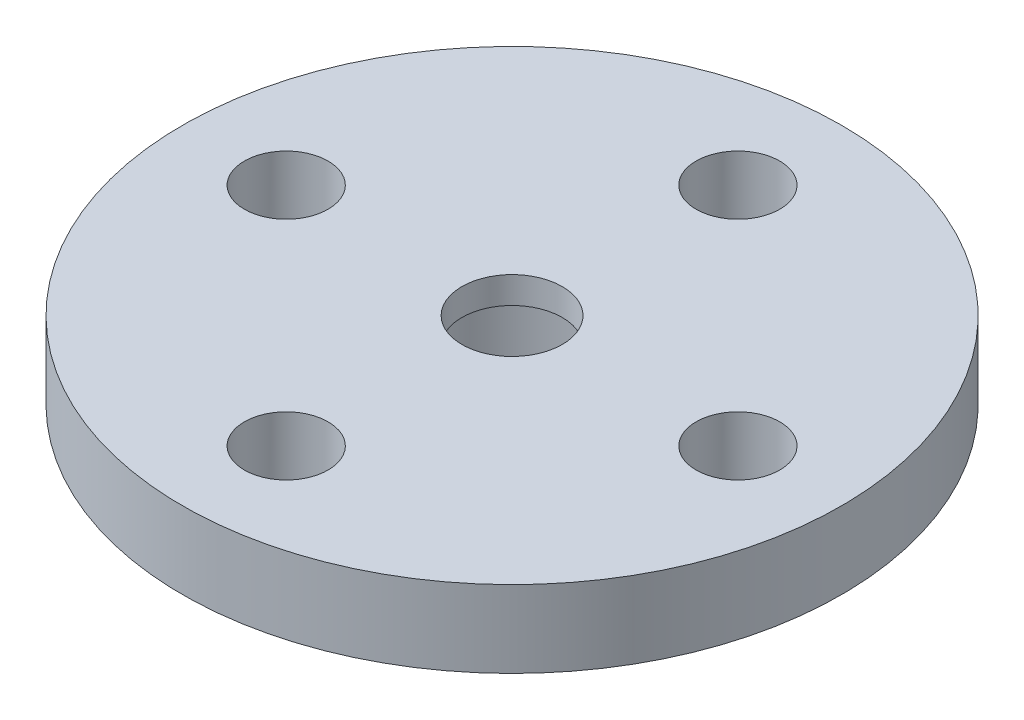
ISO-10303-21;
HEADER;
FILE_DESCRIPTION(('STEP AP214'),'2;1');
FILE_NAME('part.step','',(''),(''),'','','');
FILE_SCHEMA(('AUTOMOTIVE_DESIGN { 1 0 10303 214 1 1 1 1 }'));
ENDSEC;
DATA;
#1=APPLICATION_CONTEXT('core data for automotive mechanical design processes');
#2=APPLICATION_PROTOCOL_DEFINITION('international standard','automotive_design',2000,#1);
#3=PRODUCT_CONTEXT('',#1,'mechanical');
#4=PRODUCT('Part','Part','',(#3));
#5=PRODUCT_RELATED_PRODUCT_CATEGORY('part','',(#4));
#6=PRODUCT_DEFINITION_FORMATION('','',#4);
#7=PRODUCT_DEFINITION_CONTEXT('part definition',#1,'design');
#8=PRODUCT_DEFINITION('design','',#6,#7);
#9=PRODUCT_DEFINITION_SHAPE('','',#8);
#10=(LENGTH_UNIT() NAMED_UNIT(*) SI_UNIT(.MILLI.,.METRE.));
#11=(NAMED_UNIT(*) PLANE_ANGLE_UNIT() SI_UNIT($,.RADIAN.));
#12=(NAMED_UNIT(*) SI_UNIT($,.STERADIAN.) SOLID_ANGLE_UNIT());
#13=UNCERTAINTY_MEASURE_WITH_UNIT(LENGTH_MEASURE(1.E-05),#10,'distance_accuracy_value','');
#14=(GEOMETRIC_REPRESENTATION_CONTEXT(3) GLOBAL_UNCERTAINTY_ASSIGNED_CONTEXT((#13)) GLOBAL_UNIT_ASSIGNED_CONTEXT((#10,
#11,#12)) REPRESENTATION_CONTEXT('',''));
#15=CARTESIAN_POINT('',(0.,0.,0.));
#16=DIRECTION('',(0.,0.,1.));
#17=DIRECTION('',(1.,0.,0.));
#18=AXIS2_PLACEMENT_3D('',#15,#16,#17);
#19=CARTESIAN_POINT('',(0.,0.,0.));
#20=DIRECTION('',(0.,-1.,0.));
#21=DIRECTION('',(0.,0.,-1.));
#22=AXIS2_PLACEMENT_3D('',#19,#20,#21);
#23=CYLINDRICAL_SURFACE('',#22,1.5);
#24=CARTESIAN_POINT('',(0.,-0.8,0.));
#25=DIRECTION('',(0.,-1.,0.));
#26=DIRECTION('',(0.,0.,-1.));
#27=AXIS2_PLACEMENT_3D('',#24,#25,#26);
#28=CIRCLE('',#27,1.5);
#29=CARTESIAN_POINT('',(0.,-0.8,-1.5));
#30=VERTEX_POINT('',#29);
#31=EDGE_CURVE('E70',#30,#30,#28,.T.);
#32=ORIENTED_EDGE('',*,*,#31,.T.);
#33=EDGE_LOOP('',(#32));
#34=FACE_BOUND('',#33,.T.);
#35=CARTESIAN_POINT('',(0.,0.,0.));
#36=DIRECTION('',(0.,-1.,0.));
#37=DIRECTION('',(0.,0.,-1.));
#38=AXIS2_PLACEMENT_3D('',#35,#36,#37);
#39=CIRCLE('',#38,1.5);
#40=CARTESIAN_POINT('',(0.,0.,-1.5));
#41=VERTEX_POINT('',#40);
#42=EDGE_CURVE('E10',#41,#41,#39,.T.);
#43=ORIENTED_EDGE('',*,*,#42,.F.);
#44=EDGE_LOOP('',(#43));
#45=FACE_BOUND('',#44,.T.);
#46=ADVANCED_FACE('F42',(#34,#45),#23,.F.);
#47=CARTESIAN_POINT('',(1.5,0.,0.));
#48=DIRECTION('',(0.,1.,0.));
#49=DIRECTION('',(0.,0.,1.));
#50=AXIS2_PLACEMENT_3D('',#47,#48,#49);
#51=PLANE('',#50);
#52=CARTESIAN_POINT('',(0.,0.,-6.75));
#53=DIRECTION('',(0.,1.,0.));
#54=DIRECTION('',(0.,0.,1.));
#55=AXIS2_PLACEMENT_3D('',#52,#53,#54);
#56=CIRCLE('',#55,1.24999999999999);
#57=CARTESIAN_POINT('',(0.,0.,-5.50000000000001));
#58=VERTEX_POINT('',#57);
#59=EDGE_CURVE('E91',#58,#58,#56,.T.);
#60=ORIENTED_EDGE('',*,*,#59,.F.);
#61=EDGE_LOOP('',(#60));
#62=FACE_BOUND('',#61,.T.);
#63=CARTESIAN_POINT('',(6.75,0.,0.));
#64=DIRECTION('',(0.,1.,0.));
#65=DIRECTION('',(0.,0.,1.));
#66=AXIS2_PLACEMENT_3D('',#63,#64,#65);
#67=CIRCLE('',#66,1.24999999999999);
#68=CARTESIAN_POINT('',(6.75,0.,1.24999999999999));
#69=VERTEX_POINT('',#68);
#70=EDGE_CURVE('E85',#69,#69,#67,.T.);
#71=ORIENTED_EDGE('',*,*,#70,.F.);
#72=EDGE_LOOP('',(#71));
#73=FACE_BOUND('',#72,.T.);
#74=CARTESIAN_POINT('',(0.,0.,6.75));
#75=DIRECTION('',(0.,1.,0.));
#76=DIRECTION('',(0.,0.,1.));
#77=AXIS2_PLACEMENT_3D('',#74,#75,#76);
#78=CIRCLE('',#77,1.24999999999999);
#79=CARTESIAN_POINT('',(0.,0.,7.99999999999999));
#80=VERTEX_POINT('',#79);
#81=EDGE_CURVE('E82',#80,#80,#78,.T.);
#82=ORIENTED_EDGE('',*,*,#81,.F.);
#83=EDGE_LOOP('',(#82));
#84=FACE_BOUND('',#83,.T.);
#85=CARTESIAN_POINT('',(-6.75,0.,0.));
#86=DIRECTION('',(0.,1.,0.));
#87=DIRECTION('',(0.,0.,1.));
#88=AXIS2_PLACEMENT_3D('',#85,#86,#87);
#89=CIRCLE('',#88,1.24999999999999);
#90=CARTESIAN_POINT('',(-6.75,0.,1.24999999999999));
#91=VERTEX_POINT('',#90);
#92=EDGE_CURVE('E76',#91,#91,#89,.T.);
#93=ORIENTED_EDGE('',*,*,#92,.F.);
#94=EDGE_LOOP('',(#93));
#95=FACE_BOUND('',#94,.T.);
#96=ORIENTED_EDGE('',*,*,#42,.T.);
#97=EDGE_LOOP('',(#96));
#98=FACE_BOUND('',#97,.T.);
#99=CARTESIAN_POINT('',(0.,0.,0.));
#100=DIRECTION('',(0.,-1.,0.));
#101=DIRECTION('',(0.,0.,-1.));
#102=AXIS2_PLACEMENT_3D('',#99,#100,#101);
#103=CIRCLE('',#102,9.85);
#104=CARTESIAN_POINT('',(0.,0.,-9.85));
#105=VERTEX_POINT('',#104);
#106=EDGE_CURVE('E49',#105,#105,#103,.T.);
#107=ORIENTED_EDGE('',*,*,#106,.F.);
#108=EDGE_LOOP('',(#107));
#109=FACE_BOUND('',#108,.T.);
#110=ADVANCED_FACE('F97',(#62,#73,#84,#95,#98,#109),#51,.T.);
#111=CARTESIAN_POINT('',(0.,0.,0.));
#112=DIRECTION('',(0.,-1.,0.));
#113=DIRECTION('',(0.,0.,-1.));
#114=AXIS2_PLACEMENT_3D('',#111,#112,#113);
#115=CYLINDRICAL_SURFACE('',#114,9.85);
#116=ORIENTED_EDGE('',*,*,#106,.T.);
#117=EDGE_LOOP('',(#116));
#118=FACE_BOUND('',#117,.T.);
#119=CARTESIAN_POINT('',(0.,-2.3,0.));
#120=DIRECTION('',(0.,-1.,0.));
#121=DIRECTION('',(0.,0.,-1.));
#122=AXIS2_PLACEMENT_3D('',#119,#120,#121);
#123=CIRCLE('',#122,9.85);
#124=CARTESIAN_POINT('',(0.,-2.3,-9.85));
#125=VERTEX_POINT('',#124);
#126=EDGE_CURVE('E53',#125,#125,#123,.T.);
#127=ORIENTED_EDGE('',*,*,#126,.F.);
#128=EDGE_LOOP('',(#127));
#129=FACE_BOUND('',#128,.T.);
#130=ADVANCED_FACE('F100',(#118,#129),#115,.T.);
#131=CARTESIAN_POINT('',(9.85,-2.3,0.));
#132=DIRECTION('',(0.,-1.,0.));
#133=DIRECTION('',(0.,0.,-1.));
#134=AXIS2_PLACEMENT_3D('',#131,#132,#133);
#135=PLANE('',#134);
#136=CARTESIAN_POINT('',(0.,-2.3,-6.75));
#137=DIRECTION('',(0.,-1.,0.));
#138=DIRECTION('',(0.,0.,-1.));
#139=AXIS2_PLACEMENT_3D('',#136,#137,#138);
#140=CIRCLE('',#139,1.24999999999999);
#141=CARTESIAN_POINT('',(0.,-2.3,-7.99999999999999));
#142=VERTEX_POINT('',#141);
#143=EDGE_CURVE('E88',#142,#142,#140,.T.);
#144=ORIENTED_EDGE('',*,*,#143,.F.);
#145=EDGE_LOOP('',(#144));
#146=FACE_BOUND('',#145,.T.);
#147=CARTESIAN_POINT('',(6.75,-2.3,0.));
#148=DIRECTION('',(0.,-1.,0.));
#149=DIRECTION('',(0.,0.,-1.));
#150=AXIS2_PLACEMENT_3D('',#147,#148,#149);
#151=CIRCLE('',#150,1.24999999999999);
#152=CARTESIAN_POINT('',(6.75,-2.3,-1.24999999999999));
#153=VERTEX_POINT('',#152);
#154=EDGE_CURVE('E45',#153,#153,#151,.T.);
#155=ORIENTED_EDGE('',*,*,#154,.F.);
#156=EDGE_LOOP('',(#155));
#157=FACE_BOUND('',#156,.T.);
#158=CARTESIAN_POINT('',(0.,-2.3,6.75));
#159=DIRECTION('',(0.,-1.,0.));
#160=DIRECTION('',(0.,0.,-1.));
#161=AXIS2_PLACEMENT_3D('',#158,#159,#160);
#162=CIRCLE('',#161,1.24999999999999);
#163=CARTESIAN_POINT('',(0.,-2.3,5.50000000000001));
#164=VERTEX_POINT('',#163);
#165=EDGE_CURVE('E79',#164,#164,#162,.T.);
#166=ORIENTED_EDGE('',*,*,#165,.F.);
#167=EDGE_LOOP('',(#166));
#168=FACE_BOUND('',#167,.T.);
#169=CARTESIAN_POINT('',(-6.75,-2.3,0.));
#170=DIRECTION('',(0.,-1.,0.));
#171=DIRECTION('',(0.,0.,-1.));
#172=AXIS2_PLACEMENT_3D('',#169,#170,#171);
#173=CIRCLE('',#172,1.24999999999999);
#174=CARTESIAN_POINT('',(-6.75,-2.3,-1.24999999999999));
#175=VERTEX_POINT('',#174);
#176=EDGE_CURVE('E73',#175,#175,#173,.T.);
#177=ORIENTED_EDGE('',*,*,#176,.F.);
#178=EDGE_LOOP('',(#177));
#179=FACE_BOUND('',#178,.T.);
#180=ORIENTED_EDGE('',*,*,#126,.T.);
#181=EDGE_LOOP('',(#180));
#182=FACE_BOUND('',#181,.T.);
#183=CARTESIAN_POINT('',(0.,-2.3,0.));
#184=DIRECTION('',(0.,-1.,0.));
#185=DIRECTION('',(0.,0.,-1.));
#186=AXIS2_PLACEMENT_3D('',#183,#184,#185);
#187=CIRCLE('',#186,4.4);
#188=CARTESIAN_POINT('',(0.,-2.3,-4.4));
#189=VERTEX_POINT('',#188);
#190=EDGE_CURVE('E58',#189,#189,#187,.T.);
#191=ORIENTED_EDGE('',*,*,#190,.F.);
#192=EDGE_LOOP('',(#191));
#193=FACE_BOUND('',#192,.T.);
#194=ADVANCED_FACE('F111',(#146,#157,#168,#179,#182,#193),#135,.T.);
#195=CARTESIAN_POINT('',(0.,0.,0.));
#196=DIRECTION('',(0.,-1.,0.));
#197=DIRECTION('',(0.,0.,-1.));
#198=AXIS2_PLACEMENT_3D('',#195,#196,#197);
#199=CYLINDRICAL_SURFACE('',#198,4.4);
#200=ORIENTED_EDGE('',*,*,#190,.T.);
#201=EDGE_LOOP('',(#200));
#202=FACE_BOUND('',#201,.T.);
#203=CARTESIAN_POINT('',(0.,-4.3,0.));
#204=DIRECTION('',(0.,-1.,0.));
#205=DIRECTION('',(0.,0.,-1.));
#206=AXIS2_PLACEMENT_3D('',#203,#204,#205);
#207=CIRCLE('',#206,4.4);
#208=CARTESIAN_POINT('',(0.,-4.3,-4.4));
#209=VERTEX_POINT('',#208);
#210=EDGE_CURVE('E61',#209,#209,#207,.T.);
#211=ORIENTED_EDGE('',*,*,#210,.F.);
#212=EDGE_LOOP('',(#211));
#213=FACE_BOUND('',#212,.T.);
#214=ADVANCED_FACE('F117',(#202,#213),#199,.T.);
#215=CARTESIAN_POINT('',(4.4,-4.3,0.));
#216=DIRECTION('',(0.,-1.,0.));
#217=DIRECTION('',(0.,0.,-1.));
#218=AXIS2_PLACEMENT_3D('',#215,#216,#217);
#219=PLANE('',#218);
#220=ORIENTED_EDGE('',*,*,#210,.T.);
#221=EDGE_LOOP('',(#220));
#222=FACE_BOUND('',#221,.T.);
#223=CARTESIAN_POINT('',(0.,-4.3,0.));
#224=DIRECTION('',(0.,-1.,0.));
#225=DIRECTION('',(0.,0.,-1.));
#226=AXIS2_PLACEMENT_3D('',#223,#224,#225);
#227=CIRCLE('',#226,3.);
#228=CARTESIAN_POINT('',(0.,-4.3,-3.));
#229=VERTEX_POINT('',#228);
#230=EDGE_CURVE('E64',#229,#229,#227,.T.);
#231=ORIENTED_EDGE('',*,*,#230,.F.);
#232=EDGE_LOOP('',(#231));
#233=FACE_BOUND('',#232,.T.);
#234=ADVANCED_FACE('F124',(#222,#233),#219,.T.);
#235=CARTESIAN_POINT('',(0.,0.,0.));
#236=DIRECTION('',(0.,-1.,0.));
#237=DIRECTION('',(0.,0.,-1.));
#238=AXIS2_PLACEMENT_3D('',#235,#236,#237);
#239=CYLINDRICAL_SURFACE('',#238,3.);
#240=ORIENTED_EDGE('',*,*,#230,.T.);
#241=EDGE_LOOP('',(#240));
#242=FACE_BOUND('',#241,.T.);
#243=CARTESIAN_POINT('',(0.,-0.8,0.));
#244=DIRECTION('',(0.,-1.,0.));
#245=DIRECTION('',(0.,0.,-1.));
#246=AXIS2_PLACEMENT_3D('',#243,#244,#245);
#247=CIRCLE('',#246,3.);
#248=CARTESIAN_POINT('',(0.,-0.8,-3.));
#249=VERTEX_POINT('',#248);
#250=EDGE_CURVE('E67',#249,#249,#247,.T.);
#251=ORIENTED_EDGE('',*,*,#250,.F.);
#252=EDGE_LOOP('',(#251));
#253=FACE_BOUND('',#252,.T.);
#254=ADVANCED_FACE('F130',(#242,#253),#239,.F.);
#255=CARTESIAN_POINT('',(3.,-0.8,0.));
#256=DIRECTION('',(0.,-1.,0.));
#257=DIRECTION('',(0.,0.,-1.));
#258=AXIS2_PLACEMENT_3D('',#255,#256,#257);
#259=PLANE('',#258);
#260=ORIENTED_EDGE('',*,*,#250,.T.);
#261=EDGE_LOOP('',(#260));
#262=FACE_BOUND('',#261,.T.);
#263=ORIENTED_EDGE('',*,*,#31,.F.);
#264=EDGE_LOOP('',(#263));
#265=FACE_BOUND('',#264,.T.);
#266=ADVANCED_FACE('F136',(#262,#265),#259,.T.);
#267=CARTESIAN_POINT('',(-6.75,0.,0.));
#268=DIRECTION('',(0.,1.,0.));
#269=DIRECTION('',(0.,0.,1.));
#270=AXIS2_PLACEMENT_3D('',#267,#268,#269);
#271=CYLINDRICAL_SURFACE('',#270,1.24999999999999);
#272=ORIENTED_EDGE('',*,*,#176,.T.);
#273=EDGE_LOOP('',(#272));
#274=FACE_BOUND('',#273,.T.);
#275=ORIENTED_EDGE('',*,*,#92,.T.);
#276=EDGE_LOOP('',(#275));
#277=FACE_BOUND('',#276,.T.);
#278=ADVANCED_FACE('F142',(#274,#277),#271,.F.);
#279=CARTESIAN_POINT('',(0.,0.,6.75));
#280=DIRECTION('',(0.,1.,0.));
#281=DIRECTION('',(0.,0.,1.));
#282=AXIS2_PLACEMENT_3D('',#279,#280,#281);
#283=CYLINDRICAL_SURFACE('',#282,1.24999999999999);
#284=ORIENTED_EDGE('',*,*,#165,.T.);
#285=EDGE_LOOP('',(#284));
#286=FACE_BOUND('',#285,.T.);
#287=ORIENTED_EDGE('',*,*,#81,.T.);
#288=EDGE_LOOP('',(#287));
#289=FACE_BOUND('',#288,.T.);
#290=ADVANCED_FACE('F184',(#286,#289),#283,.F.);
#291=CARTESIAN_POINT('',(6.75,0.,0.));
#292=DIRECTION('',(0.,1.,0.));
#293=DIRECTION('',(0.,0.,1.));
#294=AXIS2_PLACEMENT_3D('',#291,#292,#293);
#295=CYLINDRICAL_SURFACE('',#294,1.24999999999999);
#296=ORIENTED_EDGE('',*,*,#154,.T.);
#297=EDGE_LOOP('',(#296));
#298=FACE_BOUND('',#297,.T.);
#299=ORIENTED_EDGE('',*,*,#70,.T.);
#300=EDGE_LOOP('',(#299));
#301=FACE_BOUND('',#300,.T.);
#302=ADVANCED_FACE('F192',(#298,#301),#295,.F.);
#303=CARTESIAN_POINT('',(0.,0.,-6.75));
#304=DIRECTION('',(0.,1.,0.));
#305=DIRECTION('',(0.,0.,1.));
#306=AXIS2_PLACEMENT_3D('',#303,#304,#305);
#307=CYLINDRICAL_SURFACE('',#306,1.24999999999999);
#308=ORIENTED_EDGE('',*,*,#143,.T.);
#309=EDGE_LOOP('',(#308));
#310=FACE_BOUND('',#309,.T.);
#311=ORIENTED_EDGE('',*,*,#59,.T.);
#312=EDGE_LOOP('',(#311));
#313=FACE_BOUND('',#312,.T.);
#314=ADVANCED_FACE('F95',(#310,#313),#307,.F.);
#315=CLOSED_SHELL('',(#46,#110,#130,#194,#214,#234,#254,#266,#278,#290,#302,#314));
#316=MANIFOLD_SOLID_BREP('B2',#315);
#317=ADVANCED_BREP_SHAPE_REPRESENTATION('',(#18,#316),#14);
#318=SHAPE_DEFINITION_REPRESENTATION(#9,#317);
ENDSEC;
END-ISO-10303-21;
